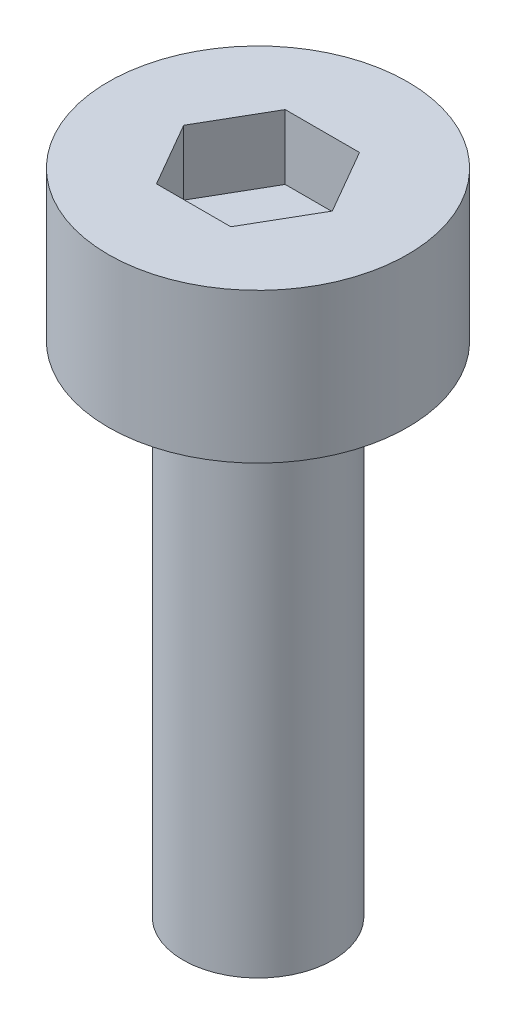
ISO-10303-21;
HEADER;
FILE_DESCRIPTION(('STEP AP214'),'2;1');
FILE_NAME('part.step','',(''),(''),'','','');
FILE_SCHEMA(('AUTOMOTIVE_DESIGN { 1 0 10303 214 1 1 1 1 }'));
ENDSEC;
DATA;
#1=APPLICATION_CONTEXT('core data for automotive mechanical design processes');
#2=APPLICATION_PROTOCOL_DEFINITION('international standard','automotive_design',2000,#1);
#3=PRODUCT_CONTEXT('',#1,'mechanical');
#4=PRODUCT('Part','Part','',(#3));
#5=PRODUCT_RELATED_PRODUCT_CATEGORY('part','',(#4));
#6=PRODUCT_DEFINITION_FORMATION('','',#4);
#7=PRODUCT_DEFINITION_CONTEXT('part definition',#1,'design');
#8=PRODUCT_DEFINITION('design','',#6,#7);
#9=PRODUCT_DEFINITION_SHAPE('','',#8);
#10=(LENGTH_UNIT() NAMED_UNIT(*) SI_UNIT(.MILLI.,.METRE.));
#11=(NAMED_UNIT(*) PLANE_ANGLE_UNIT() SI_UNIT($,.RADIAN.));
#12=(NAMED_UNIT(*) SI_UNIT($,.STERADIAN.) SOLID_ANGLE_UNIT());
#13=UNCERTAINTY_MEASURE_WITH_UNIT(LENGTH_MEASURE(1.E-05),#10,'distance_accuracy_value','');
#14=(GEOMETRIC_REPRESENTATION_CONTEXT(3) GLOBAL_UNCERTAINTY_ASSIGNED_CONTEXT((#13)) GLOBAL_UNIT_ASSIGNED_CONTEXT((#10,
#11,#12)) REPRESENTATION_CONTEXT('',''));
#15=CARTESIAN_POINT('',(0.,0.,0.));
#16=DIRECTION('',(0.,0.,1.));
#17=DIRECTION('',(1.,0.,0.));
#18=AXIS2_PLACEMENT_3D('',#15,#16,#17);
#19=CARTESIAN_POINT('',(0.,10.,0.));
#20=DIRECTION('',(0.,-1.,0.));
#21=DIRECTION('',(0.,0.,-1.));
#22=AXIS2_PLACEMENT_3D('',#19,#20,#21);
#23=CYLINDRICAL_SURFACE('',#22,1.5);
#24=CARTESIAN_POINT('',(0.,10.,0.));
#25=DIRECTION('',(0.,1.,0.));
#26=DIRECTION('',(0.,0.,1.));
#27=AXIS2_PLACEMENT_3D('',#24,#25,#26);
#28=CIRCLE('',#27,1.5);
#29=CARTESIAN_POINT('',(0.,10.,1.5));
#30=VERTEX_POINT('',#29);
#31=EDGE_CURVE('E11',#30,#30,#28,.T.);
#32=ORIENTED_EDGE('',*,*,#31,.F.);
#33=EDGE_LOOP('',(#32));
#34=FACE_BOUND('',#33,.T.);
#35=CARTESIAN_POINT('',(0.,0.,0.));
#36=DIRECTION('',(0.,1.,0.));
#37=DIRECTION('',(0.,0.,1.));
#38=AXIS2_PLACEMENT_3D('',#35,#36,#37);
#39=CIRCLE('',#38,1.5);
#40=CARTESIAN_POINT('',(0.,0.,1.5));
#41=VERTEX_POINT('',#40);
#42=EDGE_CURVE('E38',#41,#41,#39,.T.);
#43=ORIENTED_EDGE('',*,*,#42,.T.);
#44=EDGE_LOOP('',(#43));
#45=FACE_BOUND('',#44,.T.);
#46=ADVANCED_FACE('F35',(#34,#45),#23,.T.);
#47=CARTESIAN_POINT('',(0.,0.,0.));
#48=DIRECTION('',(0.,1.,0.));
#49=DIRECTION('',(0.,0.,1.));
#50=AXIS2_PLACEMENT_3D('',#47,#48,#49);
#51=PLANE('',#50);
#52=ORIENTED_EDGE('',*,*,#42,.F.);
#53=EDGE_LOOP('',(#52));
#54=FACE_BOUND('',#53,.T.);
#55=ADVANCED_FACE('F166',(#54),#51,.F.);
#56=CARTESIAN_POINT('',(0.,13.,0.));
#57=DIRECTION('',(0.,-1.,0.));
#58=DIRECTION('',(0.,0.,-1.));
#59=AXIS2_PLACEMENT_3D('',#56,#57,#58);
#60=CYLINDRICAL_SURFACE('',#59,3.);
#61=CARTESIAN_POINT('',(0.,13.,0.));
#62=DIRECTION('',(0.,1.,0.));
#63=DIRECTION('',(0.,0.,1.));
#64=AXIS2_PLACEMENT_3D('',#61,#62,#63);
#65=CIRCLE('',#64,3.);
#66=CARTESIAN_POINT('',(0.,13.,3.));
#67=VERTEX_POINT('',#66);
#68=EDGE_CURVE('E142',#67,#67,#65,.T.);
#69=ORIENTED_EDGE('',*,*,#68,.F.);
#70=EDGE_LOOP('',(#69));
#71=FACE_BOUND('',#70,.T.);
#72=CARTESIAN_POINT('',(0.,10.,0.));
#73=DIRECTION('',(0.,1.,0.));
#74=DIRECTION('',(0.,0.,1.));
#75=AXIS2_PLACEMENT_3D('',#72,#73,#74);
#76=CIRCLE('',#75,3.);
#77=CARTESIAN_POINT('',(0.,10.,3.));
#78=VERTEX_POINT('',#77);
#79=EDGE_CURVE('E136',#78,#78,#76,.T.);
#80=ORIENTED_EDGE('',*,*,#79,.T.);
#81=EDGE_LOOP('',(#80));
#82=FACE_BOUND('',#81,.T.);
#83=ADVANCED_FACE('F148',(#71,#82),#60,.T.);
#84=CARTESIAN_POINT('',(0.,13.,0.));
#85=DIRECTION('',(0.,1.,0.));
#86=DIRECTION('',(0.,0.,1.));
#87=AXIS2_PLACEMENT_3D('',#84,#85,#86);
#88=PLANE('',#87);
#89=DIRECTION('',(0.5,0.,-0.866025403784439));
#90=VECTOR('',#89,1.);
#91=CARTESIAN_POINT('',(0.744781847254617,13.,1.29));
#92=LINE('',#91,#90);
#93=CARTESIAN_POINT('',(0.744781847254617,13.,1.29));
#94=VERTEX_POINT('',#93);
#95=CARTESIAN_POINT('',(1.48956369450923,13.,0.));
#96=VERTEX_POINT('',#95);
#97=EDGE_CURVE('E49',#94,#96,#92,.T.);
#98=ORIENTED_EDGE('',*,*,#97,.F.);
#99=DIRECTION('',(1.,0.,0.));
#100=VECTOR('',#99,1.);
#101=CARTESIAN_POINT('',(-0.744781847254617,13.,1.29));
#102=LINE('',#101,#100);
#103=CARTESIAN_POINT('',(-0.744781847254617,13.,1.29));
#104=VERTEX_POINT('',#103);
#105=EDGE_CURVE('E132',#104,#94,#102,.T.);
#106=ORIENTED_EDGE('',*,*,#105,.F.);
#107=DIRECTION('',(0.5,0.,0.866025403784439));
#108=VECTOR('',#107,1.);
#109=CARTESIAN_POINT('',(-1.48956369450923,13.,0.));
#110=LINE('',#109,#108);
#111=CARTESIAN_POINT('',(-1.48956369450923,13.,0.));
#112=VERTEX_POINT('',#111);
#113=EDGE_CURVE('E130',#112,#104,#110,.T.);
#114=ORIENTED_EDGE('',*,*,#113,.F.);
#115=DIRECTION('',(-0.5,0.,0.866025403784439));
#116=VECTOR('',#115,1.);
#117=CARTESIAN_POINT('',(-0.744781847254617,13.,-1.29));
#118=LINE('',#117,#116);
#119=CARTESIAN_POINT('',(-0.744781847254617,13.,-1.29));
#120=VERTEX_POINT('',#119);
#121=EDGE_CURVE('E97',#120,#112,#118,.T.);
#122=ORIENTED_EDGE('',*,*,#121,.F.);
#123=DIRECTION('',(-1.,0.,0.));
#124=VECTOR('',#123,1.);
#125=CARTESIAN_POINT('',(0.744781847254618,13.,-1.29));
#126=LINE('',#125,#124);
#127=CARTESIAN_POINT('',(0.744781847254618,13.,-1.29));
#128=VERTEX_POINT('',#127);
#129=EDGE_CURVE('E126',#128,#120,#126,.T.);
#130=ORIENTED_EDGE('',*,*,#129,.F.);
#131=DIRECTION('',(-0.5,0.,-0.866025403784439));
#132=VECTOR('',#131,1.);
#133=CARTESIAN_POINT('',(1.48956369450923,13.,0.));
#134=LINE('',#133,#132);
#135=EDGE_CURVE('E123',#96,#128,#134,.T.);
#136=ORIENTED_EDGE('',*,*,#135,.F.);
#137=EDGE_LOOP('',(#98,#106,#114,#122,#130,#136));
#138=FACE_BOUND('',#137,.T.);
#139=ORIENTED_EDGE('',*,*,#68,.T.);
#140=EDGE_LOOP('',(#139));
#141=FACE_BOUND('',#140,.T.);
#142=ADVANCED_FACE('F153',(#138,#141),#88,.T.);
#143=CARTESIAN_POINT('',(0.,10.,0.));
#144=DIRECTION('',(0.,1.,0.));
#145=DIRECTION('',(0.,0.,1.));
#146=AXIS2_PLACEMENT_3D('',#143,#144,#145);
#147=PLANE('',#146);
#148=ORIENTED_EDGE('',*,*,#31,.T.);
#149=EDGE_LOOP('',(#148));
#150=FACE_BOUND('',#149,.T.);
#151=ORIENTED_EDGE('',*,*,#79,.F.);
#152=EDGE_LOOP('',(#151));
#153=FACE_BOUND('',#152,.T.);
#154=ADVANCED_FACE('F150',(#150,#153),#147,.F.);
#155=CARTESIAN_POINT('',(0.744781847254617,11.7,1.29));
#156=DIRECTION('',(0.866025403784439,0.,0.5));
#157=DIRECTION('',(0.5,0.,-0.866025403784439));
#158=AXIS2_PLACEMENT_3D('',#155,#156,#157);
#159=PLANE('',#158);
#160=ORIENTED_EDGE('',*,*,#97,.T.);
#161=DIRECTION('',(0.,1.,0.));
#162=VECTOR('',#161,1.);
#163=CARTESIAN_POINT('',(1.48956369450923,11.7,0.));
#164=LINE('',#163,#162);
#165=CARTESIAN_POINT('',(1.48956369450923,11.7,0.));
#166=VERTEX_POINT('',#165);
#167=EDGE_CURVE('E79',#166,#96,#164,.T.);
#168=ORIENTED_EDGE('',*,*,#167,.F.);
#169=DIRECTION('',(0.5,0.,-0.866025403784439));
#170=VECTOR('',#169,1.);
#171=CARTESIAN_POINT('',(0.744781847254617,11.7,1.29));
#172=LINE('',#171,#170);
#173=CARTESIAN_POINT('',(0.744781847254617,11.7,1.29));
#174=VERTEX_POINT('',#173);
#175=EDGE_CURVE('E134',#174,#166,#172,.T.);
#176=ORIENTED_EDGE('',*,*,#175,.F.);
#177=DIRECTION('',(0.,1.,0.));
#178=VECTOR('',#177,1.);
#179=CARTESIAN_POINT('',(0.744781847254617,11.7,1.29));
#180=LINE('',#179,#178);
#181=EDGE_CURVE('E57',#174,#94,#180,.T.);
#182=ORIENTED_EDGE('',*,*,#181,.T.);
#183=EDGE_LOOP('',(#160,#168,#176,#182));
#184=FACE_BOUND('',#183,.T.);
#185=ADVANCED_FACE('F152',(#184),#159,.F.);
#186=CARTESIAN_POINT('',(-0.744781847254617,11.7,1.29));
#187=DIRECTION('',(0.,0.,1.));
#188=DIRECTION('',(1.,0.,0.));
#189=AXIS2_PLACEMENT_3D('',#186,#187,#188);
#190=PLANE('',#189);
#191=ORIENTED_EDGE('',*,*,#105,.T.);
#192=ORIENTED_EDGE('',*,*,#181,.F.);
#193=DIRECTION('',(1.,0.,0.));
#194=VECTOR('',#193,1.);
#195=CARTESIAN_POINT('',(-0.744781847254617,11.7,1.29));
#196=LINE('',#195,#194);
#197=CARTESIAN_POINT('',(-0.744781847254617,11.7,1.29));
#198=VERTEX_POINT('',#197);
#199=EDGE_CURVE('E109',#198,#174,#196,.T.);
#200=ORIENTED_EDGE('',*,*,#199,.F.);
#201=DIRECTION('',(0.,1.,0.));
#202=VECTOR('',#201,1.);
#203=CARTESIAN_POINT('',(-0.744781847254617,11.7,1.29));
#204=LINE('',#203,#202);
#205=EDGE_CURVE('E101',#198,#104,#204,.T.);
#206=ORIENTED_EDGE('',*,*,#205,.T.);
#207=EDGE_LOOP('',(#191,#192,#200,#206));
#208=FACE_BOUND('',#207,.T.);
#209=ADVANCED_FACE('F160',(#208),#190,.F.);
#210=CARTESIAN_POINT('',(-1.48956369450923,11.7,0.));
#211=DIRECTION('',(-0.866025403784439,0.,0.5));
#212=DIRECTION('',(0.5,0.,0.866025403784439));
#213=AXIS2_PLACEMENT_3D('',#210,#211,#212);
#214=PLANE('',#213);
#215=ORIENTED_EDGE('',*,*,#113,.T.);
#216=ORIENTED_EDGE('',*,*,#205,.F.);
#217=DIRECTION('',(0.5,0.,0.866025403784439));
#218=VECTOR('',#217,1.);
#219=CARTESIAN_POINT('',(-1.48956369450923,11.7,0.));
#220=LINE('',#219,#218);
#221=CARTESIAN_POINT('',(-1.48956369450923,11.7,0.));
#222=VERTEX_POINT('',#221);
#223=EDGE_CURVE('E105',#222,#198,#220,.T.);
#224=ORIENTED_EDGE('',*,*,#223,.F.);
#225=DIRECTION('',(0.,1.,0.));
#226=VECTOR('',#225,1.);
#227=CARTESIAN_POINT('',(-1.48956369450923,11.7,0.));
#228=LINE('',#227,#226);
#229=EDGE_CURVE('E90',#222,#112,#228,.T.);
#230=ORIENTED_EDGE('',*,*,#229,.T.);
#231=EDGE_LOOP('',(#215,#216,#224,#230));
#232=FACE_BOUND('',#231,.T.);
#233=ADVANCED_FACE('F106',(#232),#214,.F.);
#234=CARTESIAN_POINT('',(-0.744781847254617,11.7,-1.29));
#235=DIRECTION('',(-0.866025403784439,0.,-0.5));
#236=DIRECTION('',(-0.5,0.,0.866025403784439));
#237=AXIS2_PLACEMENT_3D('',#234,#235,#236);
#238=PLANE('',#237);
#239=ORIENTED_EDGE('',*,*,#121,.T.);
#240=ORIENTED_EDGE('',*,*,#229,.F.);
#241=DIRECTION('',(-0.5,0.,0.866025403784439));
#242=VECTOR('',#241,1.);
#243=CARTESIAN_POINT('',(-0.744781847254617,11.7,-1.29));
#244=LINE('',#243,#242);
#245=CARTESIAN_POINT('',(-0.744781847254617,11.7,-1.29));
#246=VERTEX_POINT('',#245);
#247=EDGE_CURVE('E94',#246,#222,#244,.T.);
#248=ORIENTED_EDGE('',*,*,#247,.F.);
#249=DIRECTION('',(0.,1.,0.));
#250=VECTOR('',#249,1.);
#251=CARTESIAN_POINT('',(-0.744781847254617,11.7,-1.29));
#252=LINE('',#251,#250);
#253=EDGE_CURVE('E102',#246,#120,#252,.T.);
#254=ORIENTED_EDGE('',*,*,#253,.T.);
#255=EDGE_LOOP('',(#239,#240,#248,#254));
#256=FACE_BOUND('',#255,.T.);
#257=ADVANCED_FACE('F92',(#256),#238,.F.);
#258=CARTESIAN_POINT('',(0.744781847254618,11.7,-1.29));
#259=DIRECTION('',(0.,0.,-1.));
#260=DIRECTION('',(-1.,0.,0.));
#261=AXIS2_PLACEMENT_3D('',#258,#259,#260);
#262=PLANE('',#261);
#263=ORIENTED_EDGE('',*,*,#129,.T.);
#264=ORIENTED_EDGE('',*,*,#253,.F.);
#265=DIRECTION('',(-1.,0.,0.));
#266=VECTOR('',#265,1.);
#267=CARTESIAN_POINT('',(0.744781847254618,11.7,-1.29));
#268=LINE('',#267,#266);
#269=CARTESIAN_POINT('',(0.744781847254618,11.7,-1.29));
#270=VERTEX_POINT('',#269);
#271=EDGE_CURVE('E115',#270,#246,#268,.T.);
#272=ORIENTED_EDGE('',*,*,#271,.F.);
#273=DIRECTION('',(0.,1.,0.));
#274=VECTOR('',#273,1.);
#275=CARTESIAN_POINT('',(0.744781847254618,11.7,-1.29));
#276=LINE('',#275,#274);
#277=EDGE_CURVE('E139',#270,#128,#276,.T.);
#278=ORIENTED_EDGE('',*,*,#277,.T.);
#279=EDGE_LOOP('',(#263,#264,#272,#278));
#280=FACE_BOUND('',#279,.T.);
#281=ADVANCED_FACE('F221',(#280),#262,.F.);
#282=CARTESIAN_POINT('',(1.48956369450923,11.7,0.));
#283=DIRECTION('',(0.866025403784439,0.,-0.5));
#284=DIRECTION('',(-0.5,0.,-0.866025403784439));
#285=AXIS2_PLACEMENT_3D('',#282,#283,#284);
#286=PLANE('',#285);
#287=ORIENTED_EDGE('',*,*,#135,.T.);
#288=ORIENTED_EDGE('',*,*,#277,.F.);
#289=DIRECTION('',(-0.5,0.,-0.866025403784439));
#290=VECTOR('',#289,1.);
#291=CARTESIAN_POINT('',(1.48956369450923,11.7,0.));
#292=LINE('',#291,#290);
#293=EDGE_CURVE('E117',#166,#270,#292,.T.);
#294=ORIENTED_EDGE('',*,*,#293,.F.);
#295=ORIENTED_EDGE('',*,*,#167,.T.);
#296=EDGE_LOOP('',(#287,#288,#294,#295));
#297=FACE_BOUND('',#296,.T.);
#298=ADVANCED_FACE('F230',(#297),#286,.F.);
#299=CARTESIAN_POINT('',(0.,11.7,0.));
#300=DIRECTION('',(0.,1.,0.));
#301=DIRECTION('',(0.,0.,1.));
#302=AXIS2_PLACEMENT_3D('',#299,#300,#301);
#303=PLANE('',#302);
#304=ORIENTED_EDGE('',*,*,#175,.T.);
#305=ORIENTED_EDGE('',*,*,#293,.T.);
#306=ORIENTED_EDGE('',*,*,#271,.T.);
#307=ORIENTED_EDGE('',*,*,#247,.T.);
#308=ORIENTED_EDGE('',*,*,#223,.T.);
#309=ORIENTED_EDGE('',*,*,#199,.T.);
#310=EDGE_LOOP('',(#304,#305,#306,#307,#308,#309));
#311=FACE_BOUND('',#310,.T.);
#312=ADVANCED_FACE('F112',(#311),#303,.T.);
#313=CLOSED_SHELL('',(#46,#55,#83,#142,#154,#185,#209,#233,#257,#281,#298,#312));
#314=MANIFOLD_SOLID_BREP('B2',#313);
#315=ADVANCED_BREP_SHAPE_REPRESENTATION('',(#18,#314),#14);
#316=SHAPE_DEFINITION_REPRESENTATION(#9,#315);
ENDSEC;
END-ISO-10303-21;
